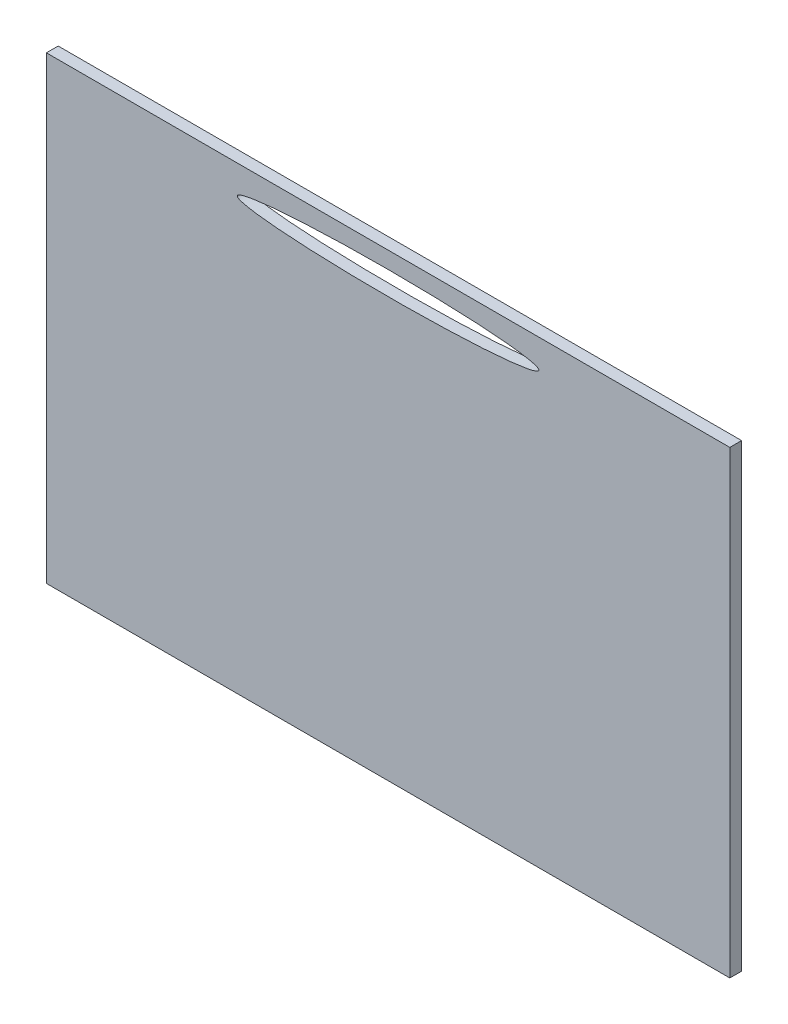
ISO-10303-21;
HEADER;
FILE_DESCRIPTION(('STEP AP214'),'2;1');
FILE_NAME('part.step','',(''),(''),'','','');
FILE_SCHEMA(('AUTOMOTIVE_DESIGN { 1 0 10303 214 1 1 1 1 }'));
ENDSEC;
DATA;
#1=APPLICATION_CONTEXT('core data for automotive mechanical design processes');
#2=APPLICATION_PROTOCOL_DEFINITION('international standard','automotive_design',2000,#1);
#3=PRODUCT_CONTEXT('',#1,'mechanical');
#4=PRODUCT('Part','Part','',(#3));
#5=PRODUCT_RELATED_PRODUCT_CATEGORY('part','',(#4));
#6=PRODUCT_DEFINITION_FORMATION('','',#4);
#7=PRODUCT_DEFINITION_CONTEXT('part definition',#1,'design');
#8=PRODUCT_DEFINITION('design','',#6,#7);
#9=PRODUCT_DEFINITION_SHAPE('','',#8);
#10=(LENGTH_UNIT() NAMED_UNIT(*) SI_UNIT(.MILLI.,.METRE.));
#11=(NAMED_UNIT(*) PLANE_ANGLE_UNIT() SI_UNIT($,.RADIAN.));
#12=(NAMED_UNIT(*) SI_UNIT($,.STERADIAN.) SOLID_ANGLE_UNIT());
#13=UNCERTAINTY_MEASURE_WITH_UNIT(LENGTH_MEASURE(1.E-05),#10,'distance_accuracy_value','');
#14=(GEOMETRIC_REPRESENTATION_CONTEXT(3) GLOBAL_UNCERTAINTY_ASSIGNED_CONTEXT((#13)) GLOBAL_UNIT_ASSIGNED_CONTEXT((#10,
#11,#12)) REPRESENTATION_CONTEXT('',''));
#15=CARTESIAN_POINT('',(0.,0.,0.));
#16=DIRECTION('',(0.,0.,1.));
#17=DIRECTION('',(1.,0.,0.));
#18=AXIS2_PLACEMENT_3D('',#15,#16,#17);
#19=CARTESIAN_POINT('',(-58.,1.99999999999997,2.));
#20=DIRECTION('',(-1.,0.,0.));
#21=DIRECTION('',(0.,0.,1.));
#22=AXIS2_PLACEMENT_3D('',#19,#20,#21);
#23=PLANE('',#22);
#24=DIRECTION('',(0.,1.,0.));
#25=VECTOR('',#24,1.);
#26=CARTESIAN_POINT('',(-58.,1.99999999999997,0.));
#27=LINE('',#26,#25);
#28=CARTESIAN_POINT('',(-58.,1.99999999999997,0.));
#29=VERTEX_POINT('',#28);
#30=CARTESIAN_POINT('',(-58.,80.,0.));
#31=VERTEX_POINT('',#30);
#32=EDGE_CURVE('E122',#29,#31,#27,.T.);
#33=ORIENTED_EDGE('',*,*,#32,.F.);
#34=DIRECTION('',(0.,0.,-1.));
#35=VECTOR('',#34,1.);
#36=CARTESIAN_POINT('',(-58.,1.99999999999997,2.));
#37=LINE('',#36,#35);
#38=CARTESIAN_POINT('',(-58.,1.99999999999997,2.));
#39=VERTEX_POINT('',#38);
#40=EDGE_CURVE('E12',#39,#29,#37,.T.);
#41=ORIENTED_EDGE('',*,*,#40,.F.);
#42=DIRECTION('',(0.,1.,0.));
#43=VECTOR('',#42,1.);
#44=CARTESIAN_POINT('',(-58.,1.99999999999997,2.));
#45=LINE('',#44,#43);
#46=CARTESIAN_POINT('',(-58.,80.,2.));
#47=VERTEX_POINT('',#46);
#48=EDGE_CURVE('E96',#39,#47,#45,.T.);
#49=ORIENTED_EDGE('',*,*,#48,.T.);
#50=DIRECTION('',(0.,0.,-1.));
#51=VECTOR('',#50,1.);
#52=CARTESIAN_POINT('',(-58.,80.,2.));
#53=LINE('',#52,#51);
#54=EDGE_CURVE('E38',#47,#31,#53,.T.);
#55=ORIENTED_EDGE('',*,*,#54,.T.);
#56=EDGE_LOOP('',(#33,#41,#49,#55));
#57=FACE_BOUND('',#56,.T.);
#58=ADVANCED_FACE('F35',(#57),#23,.T.);
#59=CARTESIAN_POINT('',(-58.,1.99999999999997,2.));
#60=DIRECTION('',(0.,1.,0.));
#61=DIRECTION('',(0.,0.,1.));
#62=AXIS2_PLACEMENT_3D('',#59,#60,#61);
#63=PLANE('',#62);
#64=DIRECTION('',(1.,0.,0.));
#65=VECTOR('',#64,1.);
#66=CARTESIAN_POINT('',(-58.,1.99999999999997,0.));
#67=LINE('',#66,#65);
#68=CARTESIAN_POINT('',(57.9999999999987,1.99999999999997,0.));
#69=VERTEX_POINT('',#68);
#70=EDGE_CURVE('E69',#29,#69,#67,.T.);
#71=ORIENTED_EDGE('',*,*,#70,.T.);
#72=DIRECTION('',(0.,0.,-1.));
#73=VECTOR('',#72,1.);
#74=CARTESIAN_POINT('',(57.9999999999987,1.99999999999997,2.));
#75=LINE('',#74,#73);
#76=CARTESIAN_POINT('',(57.9999999999987,1.99999999999997,2.));
#77=VERTEX_POINT('',#76);
#78=EDGE_CURVE('E45',#77,#69,#75,.T.);
#79=ORIENTED_EDGE('',*,*,#78,.F.);
#80=DIRECTION('',(1.,0.,0.));
#81=VECTOR('',#80,1.);
#82=CARTESIAN_POINT('',(-58.,1.99999999999997,2.));
#83=LINE('',#82,#81);
#84=EDGE_CURVE('E86',#39,#77,#83,.T.);
#85=ORIENTED_EDGE('',*,*,#84,.F.);
#86=ORIENTED_EDGE('',*,*,#40,.T.);
#87=EDGE_LOOP('',(#71,#79,#85,#86));
#88=FACE_BOUND('',#87,.T.);
#89=ADVANCED_FACE('F136',(#88),#63,.F.);
#90=CARTESIAN_POINT('',(57.9999999999987,1.99999999999997,2.));
#91=DIRECTION('',(-1.,0.,0.));
#92=DIRECTION('',(0.,0.,1.));
#93=AXIS2_PLACEMENT_3D('',#90,#91,#92);
#94=PLANE('',#93);
#95=DIRECTION('',(0.,1.,0.));
#96=VECTOR('',#95,1.);
#97=CARTESIAN_POINT('',(57.9999999999987,1.99999999999997,0.));
#98=LINE('',#97,#96);
#99=CARTESIAN_POINT('',(57.9999999999987,80.,0.));
#100=VERTEX_POINT('',#99);
#101=EDGE_CURVE('E93',#69,#100,#98,.T.);
#102=ORIENTED_EDGE('',*,*,#101,.T.);
#103=DIRECTION('',(0.,0.,-1.));
#104=VECTOR('',#103,1.);
#105=CARTESIAN_POINT('',(57.9999999999987,80.,2.));
#106=LINE('',#105,#104);
#107=CARTESIAN_POINT('',(57.9999999999987,80.,2.));
#108=VERTEX_POINT('',#107);
#109=EDGE_CURVE('E90',#108,#100,#106,.T.);
#110=ORIENTED_EDGE('',*,*,#109,.F.);
#111=DIRECTION('',(0.,1.,0.));
#112=VECTOR('',#111,1.);
#113=CARTESIAN_POINT('',(57.9999999999987,1.99999999999997,2.));
#114=LINE('',#113,#112);
#115=EDGE_CURVE('E81',#77,#108,#114,.T.);
#116=ORIENTED_EDGE('',*,*,#115,.F.);
#117=ORIENTED_EDGE('',*,*,#78,.T.);
#118=EDGE_LOOP('',(#102,#110,#116,#117));
#119=FACE_BOUND('',#118,.T.);
#120=ADVANCED_FACE('F91',(#119),#94,.F.);
#121=CARTESIAN_POINT('',(-58.,80.,2.));
#122=DIRECTION('',(0.,1.,0.));
#123=DIRECTION('',(0.,0.,1.));
#124=AXIS2_PLACEMENT_3D('',#121,#122,#123);
#125=PLANE('',#124);
#126=DIRECTION('',(1.,0.,0.));
#127=VECTOR('',#126,1.);
#128=CARTESIAN_POINT('',(-58.,80.,0.));
#129=LINE('',#128,#127);
#130=EDGE_CURVE('E126',#31,#100,#129,.T.);
#131=ORIENTED_EDGE('',*,*,#130,.F.);
#132=ORIENTED_EDGE('',*,*,#54,.F.);
#133=DIRECTION('',(1.,0.,0.));
#134=VECTOR('',#133,1.);
#135=CARTESIAN_POINT('',(-58.,80.,2.));
#136=LINE('',#135,#134);
#137=EDGE_CURVE('E85',#47,#108,#136,.T.);
#138=ORIENTED_EDGE('',*,*,#137,.T.);
#139=ORIENTED_EDGE('',*,*,#109,.T.);
#140=EDGE_LOOP('',(#131,#132,#138,#139));
#141=FACE_BOUND('',#140,.T.);
#142=ADVANCED_FACE('F95',(#141),#125,.T.);
#143=CARTESIAN_POINT('',(0.,0.,2.));
#144=DIRECTION('',(0.,0.,-1.));
#145=DIRECTION('',(-1.,0.,0.));
#146=AXIS2_PLACEMENT_3D('',#143,#144,#145);
#147=PLANE('',#146);
#148=CARTESIAN_POINT('',(0.,75.1534494307402,2.));
#149=DIRECTION('',(0.,0.,1.));
#150=DIRECTION('',(-1.,0.,0.));
#151=AXIS2_PLACEMENT_3D('',#148,#149,#150);
#152=ELLIPSE('',#151,25.5977519570825,2.);
#153=CARTESIAN_POINT('',(-25.5977519570826,75.1534494307388,2.));
#154=VERTEX_POINT('',#153);
#155=EDGE_CURVE('E127',#154,#154,#152,.T.);
#156=ORIENTED_EDGE('',*,*,#155,.F.);
#157=EDGE_LOOP('',(#156));
#158=FACE_BOUND('',#157,.T.);
#159=ORIENTED_EDGE('',*,*,#48,.F.);
#160=ORIENTED_EDGE('',*,*,#84,.T.);
#161=ORIENTED_EDGE('',*,*,#115,.T.);
#162=ORIENTED_EDGE('',*,*,#137,.F.);
#163=EDGE_LOOP('',(#159,#160,#161,#162));
#164=FACE_BOUND('',#163,.T.);
#165=ADVANCED_FACE('F84',(#158,#164),#147,.F.);
#166=CARTESIAN_POINT('',(0.,0.,0.));
#167=DIRECTION('',(0.,0.,-1.));
#168=DIRECTION('',(-1.,0.,0.));
#169=AXIS2_PLACEMENT_3D('',#166,#167,#168);
#170=PLANE('',#169);
#171=CARTESIAN_POINT('',(0.,75.1534494307402,0.));
#172=DIRECTION('',(0.,0.,1.));
#173=DIRECTION('',(-1.,0.,0.));
#174=AXIS2_PLACEMENT_3D('',#171,#172,#173);
#175=ELLIPSE('',#174,25.5977519570825,2.);
#176=CARTESIAN_POINT('',(-25.5977519570826,75.1534494307388,0.));
#177=VERTEX_POINT('',#176);
#178=EDGE_CURVE('E165',#177,#177,#175,.T.);
#179=ORIENTED_EDGE('',*,*,#178,.T.);
#180=EDGE_LOOP('',(#179));
#181=FACE_BOUND('',#180,.T.);
#182=ORIENTED_EDGE('',*,*,#32,.T.);
#183=ORIENTED_EDGE('',*,*,#130,.T.);
#184=ORIENTED_EDGE('',*,*,#101,.F.);
#185=ORIENTED_EDGE('',*,*,#70,.F.);
#186=EDGE_LOOP('',(#182,#183,#184,#185));
#187=FACE_BOUND('',#186,.T.);
#188=ADVANCED_FACE('F134',(#181,#187),#170,.T.);
#189=CARTESIAN_POINT('',(0.,75.1534494307402,-0.00100000000000013));
#190=DIRECTION('',(0.,0.,1.));
#191=DIRECTION('',(-1.,0.,0.));
#192=AXIS2_PLACEMENT_3D('',#189,#190,#191);
#193=ELLIPSE('',#192,25.5977519570825,2.);
#194=DIRECTION('',(0.,0.,1.));
#195=VECTOR('',#194,1.);
#196=SURFACE_OF_LINEAR_EXTRUSION('',#193,#195);
#197=ORIENTED_EDGE('',*,*,#178,.F.);
#198=EDGE_LOOP('',(#197));
#199=FACE_BOUND('',#198,.T.);
#200=ORIENTED_EDGE('',*,*,#155,.T.);
#201=EDGE_LOOP('',(#200));
#202=FACE_BOUND('',#201,.T.);
#203=ADVANCED_FACE('F155',(#199,#202),#196,.F.);
#204=CLOSED_SHELL('',(#58,#89,#120,#142,#165,#188,#203));
#205=MANIFOLD_SOLID_BREP('B2',#204);
#206=ADVANCED_BREP_SHAPE_REPRESENTATION('',(#18,#205),#14);
#207=SHAPE_DEFINITION_REPRESENTATION(#9,#206);
ENDSEC;
END-ISO-10303-21;
